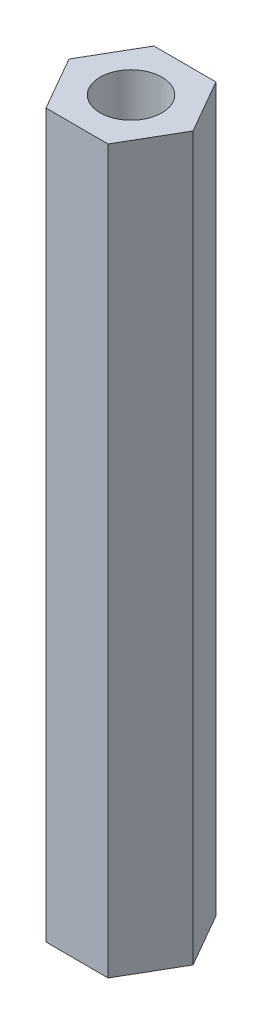
ISO-10303-21;
HEADER;
FILE_DESCRIPTION(('STEP AP214'),'2;1');
FILE_NAME('part.step','',(''),(''),'','','');
FILE_SCHEMA(('AUTOMOTIVE_DESIGN { 1 0 10303 214 1 1 1 1 }'));
ENDSEC;
DATA;
#1=APPLICATION_CONTEXT('core data for automotive mechanical design processes');
#2=APPLICATION_PROTOCOL_DEFINITION('international standard','automotive_design',2000,#1);
#3=PRODUCT_CONTEXT('',#1,'mechanical');
#4=PRODUCT('Part','Part','',(#3));
#5=PRODUCT_RELATED_PRODUCT_CATEGORY('part','',(#4));
#6=PRODUCT_DEFINITION_FORMATION('','',#4);
#7=PRODUCT_DEFINITION_CONTEXT('part definition',#1,'design');
#8=PRODUCT_DEFINITION('design','',#6,#7);
#9=PRODUCT_DEFINITION_SHAPE('','',#8);
#10=(LENGTH_UNIT() NAMED_UNIT(*) SI_UNIT(.MILLI.,.METRE.));
#11=(NAMED_UNIT(*) PLANE_ANGLE_UNIT() SI_UNIT($,.RADIAN.));
#12=(NAMED_UNIT(*) SI_UNIT($,.STERADIAN.) SOLID_ANGLE_UNIT());
#13=UNCERTAINTY_MEASURE_WITH_UNIT(LENGTH_MEASURE(1.E-05),#10,'distance_accuracy_value','');
#14=(GEOMETRIC_REPRESENTATION_CONTEXT(3) GLOBAL_UNCERTAINTY_ASSIGNED_CONTEXT((#13)) GLOBAL_UNIT_ASSIGNED_CONTEXT((#10,
#11,#12)) REPRESENTATION_CONTEXT('',''));
#15=CARTESIAN_POINT('',(0.,0.,0.));
#16=DIRECTION('',(0.,0.,1.));
#17=DIRECTION('',(1.,0.,0.));
#18=AXIS2_PLACEMENT_3D('',#15,#16,#17);
#19=CARTESIAN_POINT('',(0.,35.,0.));
#20=DIRECTION('',(0.,1.,0.));
#21=DIRECTION('',(0.,0.,1.));
#22=AXIS2_PLACEMENT_3D('',#19,#20,#21);
#23=PLANE('',#22);
#24=DIRECTION('',(0.999997397010281,0.,0.00228166006713317));
#25=VECTOR('',#24,1.);
#26=CARTESIAN_POINT('',(-1.51190292424413,35.,2.60494836786984));
#27=LINE('',#26,#25);
#28=CARTESIAN_POINT('',(-1.51190292424413,35.,2.60494836786984));
#29=VERTEX_POINT('',#28);
#30=CARTESIAN_POINT('',(1.50000000000002,35.,2.61182052438632));
#31=VERTEX_POINT('',#30);
#32=EDGE_CURVE('E131',#29,#31,#27,.T.);
#33=ORIENTED_EDGE('',*,*,#32,.T.);
#34=DIRECTION('',(0.501974674086078,0.,-0.86488231949565));
#35=VECTOR('',#34,1.);
#36=CARTESIAN_POINT('',(1.50000000000002,35.,2.61182052438632));
#37=LINE('',#36,#35);
#38=CARTESIAN_POINT('',(3.01190292424416,35.,0.00687215651648154));
#39=VERTEX_POINT('',#38);
#40=EDGE_CURVE('E89',#31,#39,#37,.T.);
#41=ORIENTED_EDGE('',*,*,#40,.T.);
#42=DIRECTION('',(-0.498022722924203,0.,-0.867163979562783));
#43=VECTOR('',#42,1.);
#44=CARTESIAN_POINT('',(3.01190292424416,35.,0.00687215651648154));
#45=LINE('',#44,#43);
#46=CARTESIAN_POINT('',(1.51190292424413,35.,-2.60494836786984));
#47=VERTEX_POINT('',#46);
#48=EDGE_CURVE('E102',#39,#47,#45,.T.);
#49=ORIENTED_EDGE('',*,*,#48,.T.);
#50=DIRECTION('',(-0.999997397010281,0.,-0.00228166006713346));
#51=VECTOR('',#50,1.);
#52=CARTESIAN_POINT('',(1.51190292424413,35.,-2.60494836786984));
#53=LINE('',#52,#51);
#54=CARTESIAN_POINT('',(-1.50000000000002,35.,-2.61182052438632));
#55=VERTEX_POINT('',#54);
#56=EDGE_CURVE('E96',#47,#55,#53,.T.);
#57=ORIENTED_EDGE('',*,*,#56,.T.);
#58=DIRECTION('',(-0.501974674086079,0.,0.86488231949565));
#59=VECTOR('',#58,1.);
#60=CARTESIAN_POINT('',(-1.50000000000002,35.,-2.61182052438632));
#61=LINE('',#60,#59);
#62=CARTESIAN_POINT('',(-3.01190292424416,35.,-0.00687215651648185));
#63=VERTEX_POINT('',#62);
#64=EDGE_CURVE('E100',#55,#63,#61,.T.);
#65=ORIENTED_EDGE('',*,*,#64,.T.);
#66=DIRECTION('',(0.498022722924203,0.,0.867163979562783));
#67=VECTOR('',#66,1.);
#68=CARTESIAN_POINT('',(-3.01190292424416,35.,-0.00687215651648185));
#69=LINE('',#68,#67);
#70=EDGE_CURVE('E52',#63,#29,#69,.T.);
#71=ORIENTED_EDGE('',*,*,#70,.T.);
#72=EDGE_LOOP('',(#33,#41,#49,#57,#65,#71));
#73=FACE_BOUND('',#72,.T.);
#74=CARTESIAN_POINT('',(0.,35.,0.));
#75=DIRECTION('',(0.,1.,0.));
#76=DIRECTION('',(0.,0.,1.));
#77=AXIS2_PLACEMENT_3D('',#74,#75,#76);
#78=CIRCLE('',#77,1.5);
#79=CARTESIAN_POINT('',(0.,35.,1.5));
#80=VERTEX_POINT('',#79);
#81=EDGE_CURVE('E124',#80,#80,#78,.T.);
#82=ORIENTED_EDGE('',*,*,#81,.F.);
#83=EDGE_LOOP('',(#82));
#84=FACE_BOUND('',#83,.T.);
#85=ADVANCED_FACE('F35',(#73,#84),#23,.T.);
#86=CARTESIAN_POINT('',(0.,0.,0.));
#87=DIRECTION('',(0.,1.,0.));
#88=DIRECTION('',(0.,0.,1.));
#89=AXIS2_PLACEMENT_3D('',#86,#87,#88);
#90=PLANE('',#89);
#91=DIRECTION('',(0.999997397010281,0.,0.00228166006713317));
#92=VECTOR('',#91,1.);
#93=CARTESIAN_POINT('',(-1.51190292424413,0.,2.60494836786984));
#94=LINE('',#93,#92);
#95=CARTESIAN_POINT('',(-1.51190292424413,0.,2.60494836786984));
#96=VERTEX_POINT('',#95);
#97=CARTESIAN_POINT('',(1.50000000000002,0.,2.61182052438632));
#98=VERTEX_POINT('',#97);
#99=EDGE_CURVE('E120',#96,#98,#94,.T.);
#100=ORIENTED_EDGE('',*,*,#99,.F.);
#101=DIRECTION('',(0.498022722924203,0.,0.867163979562783));
#102=VECTOR('',#101,1.);
#103=CARTESIAN_POINT('',(-3.01190292424416,0.,-0.00687215651648185));
#104=LINE('',#103,#102);
#105=CARTESIAN_POINT('',(-3.01190292424416,0.,-0.00687215651648185));
#106=VERTEX_POINT('',#105);
#107=EDGE_CURVE('E81',#106,#96,#104,.T.);
#108=ORIENTED_EDGE('',*,*,#107,.F.);
#109=DIRECTION('',(-0.501974674086079,0.,0.86488231949565));
#110=VECTOR('',#109,1.);
#111=CARTESIAN_POINT('',(-1.50000000000002,0.,-2.61182052438632));
#112=LINE('',#111,#110);
#113=CARTESIAN_POINT('',(-1.50000000000002,0.,-2.61182052438632));
#114=VERTEX_POINT('',#113);
#115=EDGE_CURVE('E75',#114,#106,#112,.T.);
#116=ORIENTED_EDGE('',*,*,#115,.F.);
#117=DIRECTION('',(-0.999997397010281,0.,-0.00228166006713346));
#118=VECTOR('',#117,1.);
#119=CARTESIAN_POINT('',(1.51190292424413,0.,-2.60494836786984));
#120=LINE('',#119,#118);
#121=CARTESIAN_POINT('',(1.51190292424413,0.,-2.60494836786984));
#122=VERTEX_POINT('',#121);
#123=EDGE_CURVE('E110',#122,#114,#120,.T.);
#124=ORIENTED_EDGE('',*,*,#123,.F.);
#125=DIRECTION('',(-0.498022722924203,0.,-0.867163979562783));
#126=VECTOR('',#125,1.);
#127=CARTESIAN_POINT('',(3.01190292424416,0.,0.00687215651648154));
#128=LINE('',#127,#126);
#129=CARTESIAN_POINT('',(3.01190292424416,0.,0.00687215651648154));
#130=VERTEX_POINT('',#129);
#131=EDGE_CURVE('E126',#130,#122,#128,.T.);
#132=ORIENTED_EDGE('',*,*,#131,.F.);
#133=DIRECTION('',(0.501974674086078,0.,-0.86488231949565));
#134=VECTOR('',#133,1.);
#135=CARTESIAN_POINT('',(1.50000000000002,0.,2.61182052438632));
#136=LINE('',#135,#134);
#137=EDGE_CURVE('E123',#98,#130,#136,.T.);
#138=ORIENTED_EDGE('',*,*,#137,.F.);
#139=EDGE_LOOP('',(#100,#108,#116,#124,#132,#138));
#140=FACE_BOUND('',#139,.T.);
#141=CARTESIAN_POINT('',(0.,0.,0.));
#142=DIRECTION('',(0.,1.,0.));
#143=DIRECTION('',(0.,0.,1.));
#144=AXIS2_PLACEMENT_3D('',#141,#142,#143);
#145=CIRCLE('',#144,1.5);
#146=CARTESIAN_POINT('',(0.,0.,1.5));
#147=VERTEX_POINT('',#146);
#148=EDGE_CURVE('E242',#147,#147,#145,.T.);
#149=ORIENTED_EDGE('',*,*,#148,.T.);
#150=EDGE_LOOP('',(#149));
#151=FACE_BOUND('',#150,.T.);
#152=ADVANCED_FACE('F140',(#140,#151),#90,.F.);
#153=CARTESIAN_POINT('',(-1.51190292424413,35.,2.60494836786984));
#154=DIRECTION('',(0.00228166006713317,0.,-0.999997397010281));
#155=DIRECTION('',(-0.999997397010281,0.,-0.00228166006713317));
#156=AXIS2_PLACEMENT_3D('',#153,#154,#155);
#157=PLANE('',#156);
#158=ORIENTED_EDGE('',*,*,#99,.T.);
#159=DIRECTION('',(0.,-1.,0.));
#160=VECTOR('',#159,1.);
#161=CARTESIAN_POINT('',(1.50000000000002,35.,2.61182052438632));
#162=LINE('',#161,#160);
#163=EDGE_CURVE('E11',#31,#98,#162,.T.);
#164=ORIENTED_EDGE('',*,*,#163,.F.);
#165=ORIENTED_EDGE('',*,*,#32,.F.);
#166=DIRECTION('',(0.,-1.,0.));
#167=VECTOR('',#166,1.);
#168=CARTESIAN_POINT('',(-1.51190292424413,35.,2.60494836786984));
#169=LINE('',#168,#167);
#170=EDGE_CURVE('E116',#29,#96,#169,.T.);
#171=ORIENTED_EDGE('',*,*,#170,.T.);
#172=EDGE_LOOP('',(#158,#164,#165,#171));
#173=FACE_BOUND('',#172,.T.);
#174=ADVANCED_FACE('F37',(#173),#157,.F.);
#175=CARTESIAN_POINT('',(1.50000000000002,35.,2.61182052438632));
#176=DIRECTION('',(-0.86488231949565,0.,-0.501974674086078));
#177=DIRECTION('',(-0.501974674086078,0.,0.86488231949565));
#178=AXIS2_PLACEMENT_3D('',#175,#176,#177);
#179=PLANE('',#178);
#180=ORIENTED_EDGE('',*,*,#137,.T.);
#181=DIRECTION('',(0.,-1.,0.));
#182=VECTOR('',#181,1.);
#183=CARTESIAN_POINT('',(3.01190292424416,35.,0.00687215651648154));
#184=LINE('',#183,#182);
#185=EDGE_CURVE('E44',#39,#130,#184,.T.);
#186=ORIENTED_EDGE('',*,*,#185,.F.);
#187=ORIENTED_EDGE('',*,*,#40,.F.);
#188=ORIENTED_EDGE('',*,*,#163,.T.);
#189=EDGE_LOOP('',(#180,#186,#187,#188));
#190=FACE_BOUND('',#189,.T.);
#191=ADVANCED_FACE('F165',(#190),#179,.F.);
#192=CARTESIAN_POINT('',(3.01190292424416,35.,0.00687215651648154));
#193=DIRECTION('',(-0.867163979562783,0.,0.498022722924203));
#194=DIRECTION('',(0.498022722924203,0.,0.867163979562783));
#195=AXIS2_PLACEMENT_3D('',#192,#193,#194);
#196=PLANE('',#195);
#197=ORIENTED_EDGE('',*,*,#131,.T.);
#198=DIRECTION('',(0.,-1.,0.));
#199=VECTOR('',#198,1.);
#200=CARTESIAN_POINT('',(1.51190292424413,35.,-2.60494836786984));
#201=LINE('',#200,#199);
#202=EDGE_CURVE('E111',#47,#122,#201,.T.);
#203=ORIENTED_EDGE('',*,*,#202,.F.);
#204=ORIENTED_EDGE('',*,*,#48,.F.);
#205=ORIENTED_EDGE('',*,*,#185,.T.);
#206=EDGE_LOOP('',(#197,#203,#204,#205));
#207=FACE_BOUND('',#206,.T.);
#208=ADVANCED_FACE('F137',(#207),#196,.F.);
#209=CARTESIAN_POINT('',(1.51190292424413,35.,-2.60494836786984));
#210=DIRECTION('',(-0.00228166006713346,0.,0.999997397010281));
#211=DIRECTION('',(0.999997397010281,0.,0.00228166006713346));
#212=AXIS2_PLACEMENT_3D('',#209,#210,#211);
#213=PLANE('',#212);
#214=ORIENTED_EDGE('',*,*,#123,.T.);
#215=DIRECTION('',(0.,-1.,0.));
#216=VECTOR('',#215,1.);
#217=CARTESIAN_POINT('',(-1.50000000000002,35.,-2.61182052438632));
#218=LINE('',#217,#216);
#219=EDGE_CURVE('E107',#55,#114,#218,.T.);
#220=ORIENTED_EDGE('',*,*,#219,.F.);
#221=ORIENTED_EDGE('',*,*,#56,.F.);
#222=ORIENTED_EDGE('',*,*,#202,.T.);
#223=EDGE_LOOP('',(#214,#220,#221,#222));
#224=FACE_BOUND('',#223,.T.);
#225=ADVANCED_FACE('F108',(#224),#213,.F.);
#226=CARTESIAN_POINT('',(-1.50000000000002,35.,-2.61182052438632));
#227=DIRECTION('',(0.86488231949565,0.,0.501974674086079));
#228=DIRECTION('',(0.501974674086079,0.,-0.86488231949565));
#229=AXIS2_PLACEMENT_3D('',#226,#227,#228);
#230=PLANE('',#229);
#231=ORIENTED_EDGE('',*,*,#115,.T.);
#232=DIRECTION('',(0.,-1.,0.));
#233=VECTOR('',#232,1.);
#234=CARTESIAN_POINT('',(-3.01190292424416,35.,-0.00687215651648185));
#235=LINE('',#234,#233);
#236=EDGE_CURVE('E112',#63,#106,#235,.T.);
#237=ORIENTED_EDGE('',*,*,#236,.F.);
#238=ORIENTED_EDGE('',*,*,#64,.F.);
#239=ORIENTED_EDGE('',*,*,#219,.T.);
#240=EDGE_LOOP('',(#231,#237,#238,#239));
#241=FACE_BOUND('',#240,.T.);
#242=ADVANCED_FACE('F114',(#241),#230,.F.);
#243=CARTESIAN_POINT('',(-3.01190292424416,35.,-0.00687215651648185));
#244=DIRECTION('',(0.867163979562783,0.,-0.498022722924203));
#245=DIRECTION('',(-0.498022722924203,0.,-0.867163979562783));
#246=AXIS2_PLACEMENT_3D('',#243,#244,#245);
#247=PLANE('',#246);
#248=ORIENTED_EDGE('',*,*,#107,.T.);
#249=ORIENTED_EDGE('',*,*,#170,.F.);
#250=ORIENTED_EDGE('',*,*,#70,.F.);
#251=ORIENTED_EDGE('',*,*,#236,.T.);
#252=EDGE_LOOP('',(#248,#249,#250,#251));
#253=FACE_BOUND('',#252,.T.);
#254=ADVANCED_FACE('F145',(#253),#247,.F.);
#255=CARTESIAN_POINT('',(0.,35.,0.));
#256=DIRECTION('',(0.,-1.,0.));
#257=DIRECTION('',(0.,0.,-1.));
#258=AXIS2_PLACEMENT_3D('',#255,#256,#257);
#259=CYLINDRICAL_SURFACE('',#258,1.5);
#260=ORIENTED_EDGE('',*,*,#81,.T.);
#261=EDGE_LOOP('',(#260));
#262=FACE_BOUND('',#261,.T.);
#263=ORIENTED_EDGE('',*,*,#148,.F.);
#264=EDGE_LOOP('',(#263));
#265=FACE_BOUND('',#264,.T.);
#266=ADVANCED_FACE('F147',(#262,#265),#259,.F.);
#267=CLOSED_SHELL('',(#85,#152,#174,#191,#208,#225,#242,#254,#266));
#268=MANIFOLD_SOLID_BREP('B2',#267);
#269=ADVANCED_BREP_SHAPE_REPRESENTATION('',(#18,#268),#14);
#270=SHAPE_DEFINITION_REPRESENTATION(#9,#269);
ENDSEC;
END-ISO-10303-21;
